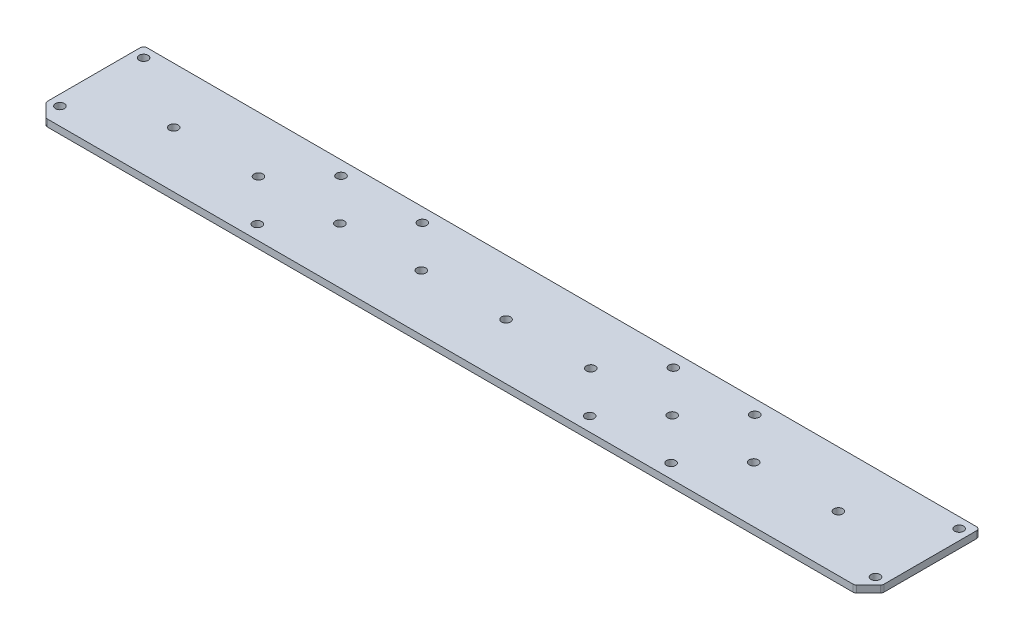
ISO-10303-21;
HEADER;
FILE_DESCRIPTION(('STEP AP214'),'2;1');
FILE_NAME('part.step','',(''),(''),'','','');
FILE_SCHEMA(('AUTOMOTIVE_DESIGN { 1 0 10303 214 1 1 1 1 }'));
ENDSEC;
DATA;
#1=APPLICATION_CONTEXT('core data for automotive mechanical design processes');
#2=APPLICATION_PROTOCOL_DEFINITION('international standard','automotive_design',2000,#1);
#3=PRODUCT_CONTEXT('',#1,'mechanical');
#4=PRODUCT('Part','Part','',(#3));
#5=PRODUCT_RELATED_PRODUCT_CATEGORY('part','',(#4));
#6=PRODUCT_DEFINITION_FORMATION('','',#4);
#7=PRODUCT_DEFINITION_CONTEXT('part definition',#1,'design');
#8=PRODUCT_DEFINITION('design','',#6,#7);
#9=PRODUCT_DEFINITION_SHAPE('','',#8);
#10=(LENGTH_UNIT() NAMED_UNIT(*) SI_UNIT(.MILLI.,.METRE.));
#11=(NAMED_UNIT(*) PLANE_ANGLE_UNIT() SI_UNIT($,.RADIAN.));
#12=(NAMED_UNIT(*) SI_UNIT($,.STERADIAN.) SOLID_ANGLE_UNIT());
#13=UNCERTAINTY_MEASURE_WITH_UNIT(LENGTH_MEASURE(1.E-05),#10,'distance_accuracy_value','');
#14=(GEOMETRIC_REPRESENTATION_CONTEXT(3) GLOBAL_UNCERTAINTY_ASSIGNED_CONTEXT((#13)) GLOBAL_UNIT_ASSIGNED_CONTEXT((#10,
#11,#12)) REPRESENTATION_CONTEXT('',''));
#15=CARTESIAN_POINT('',(0.,0.,0.));
#16=DIRECTION('',(0.,0.,1.));
#17=DIRECTION('',(1.,0.,0.));
#18=AXIS2_PLACEMENT_3D('',#15,#16,#17);
#19=CARTESIAN_POINT('',(0.,3.175,-50.7999999999972));
#20=DIRECTION('',(0.,0.,1.));
#21=DIRECTION('',(1.,0.,0.));
#22=AXIS2_PLACEMENT_3D('',#19,#20,#21);
#23=PLANE('',#22);
#24=DIRECTION('',(-1.,0.,0.));
#25=VECTOR('',#24,1.);
#26=CARTESIAN_POINT('',(0.,0.,-50.7999999999972));
#27=LINE('',#26,#25);
#28=CARTESIAN_POINT('',(379.412499999997,0.,-50.7999999999944));
#29=VERTEX_POINT('',#28);
#30=CARTESIAN_POINT('',(1.58749999999989,0.,-50.7999999999972));
#31=VERTEX_POINT('',#30);
#32=EDGE_CURVE('E226',#29,#31,#27,.T.);
#33=ORIENTED_EDGE('',*,*,#32,.T.);
#34=DIRECTION('',(0.,-1.,0.));
#35=VECTOR('',#34,1.);
#36=CARTESIAN_POINT('',(1.58749999999989,3.175,-50.7999999999972));
#37=LINE('',#36,#35);
#38=CARTESIAN_POINT('',(1.58749999999989,3.175,-50.7999999999972));
#39=VERTEX_POINT('',#38);
#40=EDGE_CURVE('E69',#31,#39,#37,.F.);
#41=ORIENTED_EDGE('',*,*,#40,.T.);
#42=DIRECTION('',(-1.,0.,0.));
#43=VECTOR('',#42,1.);
#44=CARTESIAN_POINT('',(0.,3.175,-50.7999999999972));
#45=LINE('',#44,#43);
#46=CARTESIAN_POINT('',(379.412499999997,3.175,-50.7999999999944));
#47=VERTEX_POINT('',#46);
#48=EDGE_CURVE('E165',#47,#39,#45,.T.);
#49=ORIENTED_EDGE('',*,*,#48,.F.);
#50=DIRECTION('',(0.,-1.,0.));
#51=VECTOR('',#50,1.);
#52=CARTESIAN_POINT('',(379.412499999997,3.175,-50.7999999999944));
#53=LINE('',#52,#51);
#54=EDGE_CURVE('E285',#47,#29,#53,.T.);
#55=ORIENTED_EDGE('',*,*,#54,.T.);
#56=EDGE_LOOP('',(#33,#41,#49,#55));
#57=FACE_BOUND('',#56,.T.);
#58=ADVANCED_FACE('F48',(#57),#23,.F.);
#59=CARTESIAN_POINT('',(-3.21964677141295E-12,3.175,-7.00756403026172));
#60=DIRECTION('',(1.,0.,0.));
#61=DIRECTION('',(0.,0.,-1.));
#62=AXIS2_PLACEMENT_3D('',#59,#60,#61);
#63=PLANE('',#62);
#64=DIRECTION('',(0.,0.,1.));
#65=VECTOR('',#64,1.);
#66=CARTESIAN_POINT('',(-3.21964677141295E-12,3.175,-7.00756403026172));
#67=LINE('',#66,#65);
#68=CARTESIAN_POINT('',(-1.16713974375621E-13,3.175,-49.2124999999973));
#69=VERTEX_POINT('',#68);
#70=CARTESIAN_POINT('',(-3.21964677141295E-12,3.175,-7.00756403026172));
#71=VERTEX_POINT('',#70);
#72=EDGE_CURVE('E154',#69,#71,#67,.T.);
#73=ORIENTED_EDGE('',*,*,#72,.F.);
#74=DIRECTION('',(0.,-1.,0.));
#75=VECTOR('',#74,1.);
#76=CARTESIAN_POINT('',(-1.16713974375621E-13,3.175,-49.2124999999973));
#77=LINE('',#76,#75);
#78=CARTESIAN_POINT('',(-1.16713974375621E-13,0.,-49.2124999999973));
#79=VERTEX_POINT('',#78);
#80=EDGE_CURVE('E175',#69,#79,#77,.T.);
#81=ORIENTED_EDGE('',*,*,#80,.T.);
#82=DIRECTION('',(0.,0.,1.));
#83=VECTOR('',#82,1.);
#84=CARTESIAN_POINT('',(-3.21964677141295E-12,0.,-7.00756403026172));
#85=LINE('',#84,#83);
#86=CARTESIAN_POINT('',(-3.21964677141295E-12,0.,-7.00756403026172));
#87=VERTEX_POINT('',#86);
#88=EDGE_CURVE('E171',#79,#87,#85,.T.);
#89=ORIENTED_EDGE('',*,*,#88,.T.);
#90=DIRECTION('',(0.,-1.,0.));
#91=VECTOR('',#90,1.);
#92=CARTESIAN_POINT('',(-3.21964677141295E-12,3.175,-7.00756403026172));
#93=LINE('',#92,#91);
#94=EDGE_CURVE('E168',#71,#87,#93,.T.);
#95=ORIENTED_EDGE('',*,*,#94,.F.);
#96=EDGE_LOOP('',(#73,#81,#89,#95));
#97=FACE_BOUND('',#96,.T.);
#98=ADVANCED_FACE('F169',(#97),#63,.F.);
#99=CARTESIAN_POINT('',(1.5874999999968,3.175,-7.00756403026172));
#100=DIRECTION('',(0.,-1.,0.));
#101=DIRECTION('',(0.,0.,-1.));
#102=AXIS2_PLACEMENT_3D('',#99,#100,#101);
#103=CYLINDRICAL_SURFACE('',#102,1.5875);
#104=CARTESIAN_POINT('',(1.5874999999968,0.,-7.00756403026172));
#105=DIRECTION('',(0.,1.,0.));
#106=DIRECTION('',(0.,0.,1.));
#107=AXIS2_PLACEMENT_3D('',#104,#105,#106);
#108=CIRCLE('',#107,1.5875);
#109=CARTESIAN_POINT('',(0.46496798486316,0.,-5.88503201512807));
#110=VERTEX_POINT('',#109);
#111=EDGE_CURVE('E232',#87,#110,#108,.T.);
#112=ORIENTED_EDGE('',*,*,#111,.T.);
#113=DIRECTION('',(0.,-1.,0.));
#114=VECTOR('',#113,1.);
#115=CARTESIAN_POINT('',(0.46496798486316,3.175,-5.88503201512807));
#116=LINE('',#115,#114);
#117=CARTESIAN_POINT('',(0.46496798486316,3.175,-5.88503201512807));
#118=VERTEX_POINT('',#117);
#119=EDGE_CURVE('E176',#118,#110,#116,.T.);
#120=ORIENTED_EDGE('',*,*,#119,.F.);
#121=CARTESIAN_POINT('',(1.5874999999968,3.175,-7.00756403026172));
#122=DIRECTION('',(0.,1.,0.));
#123=DIRECTION('',(0.,0.,1.));
#124=AXIS2_PLACEMENT_3D('',#121,#122,#123);
#125=CIRCLE('',#124,1.5875);
#126=EDGE_CURVE('E158',#71,#118,#125,.T.);
#127=ORIENTED_EDGE('',*,*,#126,.F.);
#128=ORIENTED_EDGE('',*,*,#94,.T.);
#129=EDGE_LOOP('',(#112,#120,#127,#128));
#130=FACE_BOUND('',#129,.T.);
#131=ADVANCED_FACE('F178',(#130),#103,.T.);
#132=CARTESIAN_POINT('',(5.88503201513041,3.175,-0.464967984860809));
#133=DIRECTION('',(0.70710678118655,0.,-0.707106781186545));
#134=DIRECTION('',(-0.707106781186545,0.,-0.70710678118655));
#135=AXIS2_PLACEMENT_3D('',#132,#133,#134);
#136=PLANE('',#135);
#137=DIRECTION('',(0.707106781186545,0.,0.70710678118655));
#138=VECTOR('',#137,1.);
#139=CARTESIAN_POINT('',(5.88503201513041,0.,-0.464967984860809));
#140=LINE('',#139,#138);
#141=CARTESIAN_POINT('',(5.88503201513041,0.,-0.464967984860809));
#142=VERTEX_POINT('',#141);
#143=EDGE_CURVE('E235',#110,#142,#140,.T.);
#144=ORIENTED_EDGE('',*,*,#143,.T.);
#145=DIRECTION('',(0.,-1.,0.));
#146=VECTOR('',#145,1.);
#147=CARTESIAN_POINT('',(5.88503201513041,3.175,-0.464967984860809));
#148=LINE('',#147,#146);
#149=CARTESIAN_POINT('',(5.88503201513041,3.175,-0.464967984860809));
#150=VERTEX_POINT('',#149);
#151=EDGE_CURVE('E275',#150,#142,#148,.T.);
#152=ORIENTED_EDGE('',*,*,#151,.F.);
#153=DIRECTION('',(0.707106781186545,0.,0.70710678118655));
#154=VECTOR('',#153,1.);
#155=CARTESIAN_POINT('',(5.88503201513041,3.175,-0.464967984860809));
#156=LINE('',#155,#154);
#157=EDGE_CURVE('E182',#118,#150,#156,.T.);
#158=ORIENTED_EDGE('',*,*,#157,.F.);
#159=ORIENTED_EDGE('',*,*,#119,.T.);
#160=EDGE_LOOP('',(#144,#152,#158,#159));
#161=FACE_BOUND('',#160,.T.);
#162=ADVANCED_FACE('F465',(#161),#136,.F.);
#163=CARTESIAN_POINT('',(7.00756403026404,3.175,-1.58749999999442));
#164=DIRECTION('',(0.,-1.,0.));
#165=DIRECTION('',(0.,0.,-1.));
#166=AXIS2_PLACEMENT_3D('',#163,#164,#165);
#167=CYLINDRICAL_SURFACE('',#166,1.58749999999998);
#168=CARTESIAN_POINT('',(7.00756403026404,0.,-1.58749999999442));
#169=DIRECTION('',(0.,1.,0.));
#170=DIRECTION('',(0.,0.,1.));
#171=AXIS2_PLACEMENT_3D('',#168,#169,#170);
#172=CIRCLE('',#171,1.58749999999998);
#173=CARTESIAN_POINT('',(7.00756403026404,0.,5.55957190007117E-12));
#174=VERTEX_POINT('',#173);
#175=EDGE_CURVE('E238',#142,#174,#172,.T.);
#176=ORIENTED_EDGE('',*,*,#175,.T.);
#177=DIRECTION('',(0.,-1.,0.));
#178=VECTOR('',#177,1.);
#179=CARTESIAN_POINT('',(7.00756403026404,3.175,5.55957190007117E-12));
#180=LINE('',#179,#178);
#181=CARTESIAN_POINT('',(7.00756403026404,3.175,5.55957190007117E-12));
#182=VERTEX_POINT('',#181);
#183=EDGE_CURVE('E271',#182,#174,#180,.T.);
#184=ORIENTED_EDGE('',*,*,#183,.F.);
#185=CARTESIAN_POINT('',(7.00756403026404,3.175,-1.58749999999442));
#186=DIRECTION('',(0.,1.,0.));
#187=DIRECTION('',(0.,0.,1.));
#188=AXIS2_PLACEMENT_3D('',#185,#186,#187);
#189=CIRCLE('',#188,1.58749999999998);
#190=EDGE_CURVE('E187',#150,#182,#189,.T.);
#191=ORIENTED_EDGE('',*,*,#190,.F.);
#192=ORIENTED_EDGE('',*,*,#151,.T.);
#193=EDGE_LOOP('',(#176,#184,#191,#192));
#194=FACE_BOUND('',#193,.T.);
#195=ADVANCED_FACE('F472',(#194),#167,.T.);
#196=CARTESIAN_POINT('',(373.992435969729,3.175,5.57593004926383E-12));
#197=DIRECTION('',(0.,0.,-1.));
#198=DIRECTION('',(-1.,0.,0.));
#199=AXIS2_PLACEMENT_3D('',#196,#197,#198);
#200=PLANE('',#199);
#201=DIRECTION('',(1.,0.,0.));
#202=VECTOR('',#201,1.);
#203=CARTESIAN_POINT('',(373.992435969729,0.,5.57593004926383E-12));
#204=LINE('',#203,#202);
#205=CARTESIAN_POINT('',(373.992435969729,0.,5.57593004926383E-12));
#206=VERTEX_POINT('',#205);
#207=EDGE_CURVE('E241',#174,#206,#204,.T.);
#208=ORIENTED_EDGE('',*,*,#207,.T.);
#209=DIRECTION('',(0.,-1.,0.));
#210=VECTOR('',#209,1.);
#211=CARTESIAN_POINT('',(373.992435969729,3.175,5.57593004926383E-12));
#212=LINE('',#211,#210);
#213=CARTESIAN_POINT('',(373.992435969729,3.175,5.57593004926383E-12));
#214=VERTEX_POINT('',#213);
#215=EDGE_CURVE('E267',#214,#206,#212,.T.);
#216=ORIENTED_EDGE('',*,*,#215,.F.);
#217=DIRECTION('',(1.,0.,0.));
#218=VECTOR('',#217,1.);
#219=CARTESIAN_POINT('',(373.992435969729,3.175,5.57593004926383E-12));
#220=LINE('',#219,#218);
#221=EDGE_CURVE('E204',#182,#214,#220,.T.);
#222=ORIENTED_EDGE('',*,*,#221,.F.);
#223=ORIENTED_EDGE('',*,*,#183,.T.);
#224=EDGE_LOOP('',(#208,#216,#222,#223));
#225=FACE_BOUND('',#224,.T.);
#226=ADVANCED_FACE('F475',(#225),#200,.F.);
#227=CARTESIAN_POINT('',(373.992435969729,3.175,-1.58749999999442));
#228=DIRECTION('',(0.,-1.,0.));
#229=DIRECTION('',(0.,0.,-1.));
#230=AXIS2_PLACEMENT_3D('',#227,#228,#229);
#231=CYLINDRICAL_SURFACE('',#230,1.58750000000001);
#232=CARTESIAN_POINT('',(373.992435969729,0.,-1.58749999999442));
#233=DIRECTION('',(0.,1.,0.));
#234=DIRECTION('',(0.,0.,1.));
#235=AXIS2_PLACEMENT_3D('',#232,#233,#234);
#236=CIRCLE('',#235,1.58750000000001);
#237=CARTESIAN_POINT('',(375.114967984863,0.,-0.464967984860794));
#238=VERTEX_POINT('',#237);
#239=EDGE_CURVE('E244',#206,#238,#236,.T.);
#240=ORIENTED_EDGE('',*,*,#239,.T.);
#241=DIRECTION('',(0.,-1.,0.));
#242=VECTOR('',#241,1.);
#243=CARTESIAN_POINT('',(375.114967984863,3.175,-0.464967984860794));
#244=LINE('',#243,#242);
#245=CARTESIAN_POINT('',(375.114967984863,3.175,-0.464967984860794));
#246=VERTEX_POINT('',#245);
#247=EDGE_CURVE('E263',#246,#238,#244,.T.);
#248=ORIENTED_EDGE('',*,*,#247,.F.);
#249=CARTESIAN_POINT('',(373.992435969729,3.175,-1.58749999999442));
#250=DIRECTION('',(0.,1.,0.));
#251=DIRECTION('',(0.,0.,1.));
#252=AXIS2_PLACEMENT_3D('',#249,#250,#251);
#253=CIRCLE('',#252,1.58750000000001);
#254=EDGE_CURVE('E208',#214,#246,#253,.T.);
#255=ORIENTED_EDGE('',*,*,#254,.F.);
#256=ORIENTED_EDGE('',*,*,#215,.T.);
#257=EDGE_LOOP('',(#240,#248,#255,#256));
#258=FACE_BOUND('',#257,.T.);
#259=ADVANCED_FACE('F480',(#258),#231,.T.);
#260=CARTESIAN_POINT('',(375.114967984863,3.175,-0.46496798486078));
#261=DIRECTION('',(-0.707106781186547,0.,-0.707106781186548));
#262=DIRECTION('',(-0.707106781186548,0.,0.707106781186547));
#263=AXIS2_PLACEMENT_3D('',#260,#261,#262);
#264=PLANE('',#263);
#265=DIRECTION('',(0.707106781186548,0.,-0.707106781186547));
#266=VECTOR('',#265,1.);
#267=CARTESIAN_POINT('',(375.114967984863,0.,-0.46496798486078));
#268=LINE('',#267,#266);
#269=CARTESIAN_POINT('',(380.53503201513,0.,-5.88503201512807));
#270=VERTEX_POINT('',#269);
#271=EDGE_CURVE('E247',#238,#270,#268,.T.);
#272=ORIENTED_EDGE('',*,*,#271,.T.);
#273=DIRECTION('',(0.,-1.,0.));
#274=VECTOR('',#273,1.);
#275=CARTESIAN_POINT('',(380.53503201513,3.175,-5.88503201512807));
#276=LINE('',#275,#274);
#277=CARTESIAN_POINT('',(380.53503201513,3.175,-5.88503201512807));
#278=VERTEX_POINT('',#277);
#279=EDGE_CURVE('E259',#278,#270,#276,.T.);
#280=ORIENTED_EDGE('',*,*,#279,.F.);
#281=DIRECTION('',(0.707106781186548,0.,-0.707106781186547));
#282=VECTOR('',#281,1.);
#283=CARTESIAN_POINT('',(375.114967984863,3.175,-0.46496798486078));
#284=LINE('',#283,#282);
#285=EDGE_CURVE('E212',#246,#278,#284,.T.);
#286=ORIENTED_EDGE('',*,*,#285,.F.);
#287=ORIENTED_EDGE('',*,*,#247,.T.);
#288=EDGE_LOOP('',(#272,#280,#286,#287));
#289=FACE_BOUND('',#288,.T.);
#290=ADVANCED_FACE('F487',(#289),#264,.F.);
#291=CARTESIAN_POINT('',(379.412499999997,3.175,-7.00756403026171));
#292=DIRECTION('',(0.,-1.,0.));
#293=DIRECTION('',(0.,0.,-1.));
#294=AXIS2_PLACEMENT_3D('',#291,#292,#293);
#295=CYLINDRICAL_SURFACE('',#294,1.58750000000002);
#296=CARTESIAN_POINT('',(379.412499999997,0.,-7.00756403026171));
#297=DIRECTION('',(0.,1.,0.));
#298=DIRECTION('',(0.,0.,1.));
#299=AXIS2_PLACEMENT_3D('',#296,#297,#298);
#300=CIRCLE('',#299,1.58750000000002);
#301=CARTESIAN_POINT('',(380.999999999997,0.,-7.00756403026171));
#302=VERTEX_POINT('',#301);
#303=EDGE_CURVE('E250',#270,#302,#300,.T.);
#304=ORIENTED_EDGE('',*,*,#303,.T.);
#305=DIRECTION('',(0.,-1.,0.));
#306=VECTOR('',#305,1.);
#307=CARTESIAN_POINT('',(380.999999999997,3.175,-7.00756403026171));
#308=LINE('',#307,#306);
#309=CARTESIAN_POINT('',(380.999999999997,3.175,-7.00756403026171));
#310=VERTEX_POINT('',#309);
#311=EDGE_CURVE('E225',#310,#302,#308,.T.);
#312=ORIENTED_EDGE('',*,*,#311,.F.);
#313=CARTESIAN_POINT('',(379.412499999997,3.175,-7.00756403026171));
#314=DIRECTION('',(0.,1.,0.));
#315=DIRECTION('',(0.,0.,1.));
#316=AXIS2_PLACEMENT_3D('',#313,#314,#315);
#317=CIRCLE('',#316,1.58750000000002);
#318=EDGE_CURVE('E218',#278,#310,#317,.T.);
#319=ORIENTED_EDGE('',*,*,#318,.F.);
#320=ORIENTED_EDGE('',*,*,#279,.T.);
#321=EDGE_LOOP('',(#304,#312,#319,#320));
#322=FACE_BOUND('',#321,.T.);
#323=ADVANCED_FACE('F491',(#322),#295,.T.);
#324=CARTESIAN_POINT('',(380.999999999997,3.175,-50.7999999999944));
#325=DIRECTION('',(-1.,0.,0.));
#326=DIRECTION('',(0.,0.,1.));
#327=AXIS2_PLACEMENT_3D('',#324,#325,#326);
#328=PLANE('',#327);
#329=DIRECTION('',(0.,0.,-1.));
#330=VECTOR('',#329,1.);
#331=CARTESIAN_POINT('',(380.999999999997,0.,-50.7999999999944));
#332=LINE('',#331,#330);
#333=CARTESIAN_POINT('',(380.999999999997,0.,-49.2124999999944));
#334=VERTEX_POINT('',#333);
#335=EDGE_CURVE('E253',#302,#334,#332,.T.);
#336=ORIENTED_EDGE('',*,*,#335,.T.);
#337=DIRECTION('',(0.,-1.,0.));
#338=VECTOR('',#337,1.);
#339=CARTESIAN_POINT('',(380.999999999997,3.175,-49.2124999999944));
#340=LINE('',#339,#338);
#341=CARTESIAN_POINT('',(380.999999999997,3.175,-49.2124999999944));
#342=VERTEX_POINT('',#341);
#343=EDGE_CURVE('E12',#334,#342,#340,.F.);
#344=ORIENTED_EDGE('',*,*,#343,.T.);
#345=DIRECTION('',(0.,0.,-1.));
#346=VECTOR('',#345,1.);
#347=CARTESIAN_POINT('',(380.999999999997,3.175,-50.7999999999944));
#348=LINE('',#347,#346);
#349=EDGE_CURVE('E221',#310,#342,#348,.T.);
#350=ORIENTED_EDGE('',*,*,#349,.F.);
#351=ORIENTED_EDGE('',*,*,#311,.T.);
#352=EDGE_LOOP('',(#336,#344,#350,#351));
#353=FACE_BOUND('',#352,.T.);
#354=ADVANCED_FACE('F493',(#353),#328,.F.);
#355=CARTESIAN_POINT('',(379.412499999997,3.175,-7.00756403026171));
#356=DIRECTION('',(0.,1.,0.));
#357=DIRECTION('',(0.,0.,1.));
#358=AXIS2_PLACEMENT_3D('',#355,#356,#357);
#359=PLANE('',#358);
#360=CARTESIAN_POINT('',(190.5,3.175,-25.399999999993));
#361=DIRECTION('',(0.,1.,0.));
#362=DIRECTION('',(0.,0.,1.));
#363=AXIS2_PLACEMENT_3D('',#360,#361,#362);
#364=CIRCLE('',#363,2.03200000000166);
#365=CARTESIAN_POINT('',(190.5,3.175,-23.3679999999914));
#366=VERTEX_POINT('',#365);
#367=EDGE_CURVE('E355',#366,#366,#364,.T.);
#368=ORIENTED_EDGE('',*,*,#367,.F.);
#369=EDGE_LOOP('',(#368));
#370=FACE_BOUND('',#369,.T.);
#371=CARTESIAN_POINT('',(133.35,3.175,-44.449999999993));
#372=DIRECTION('',(0.,1.,0.));
#373=DIRECTION('',(0.,0.,1.));
#374=AXIS2_PLACEMENT_3D('',#371,#372,#373);
#375=CIRCLE('',#374,2.0320000000016);
#376=CARTESIAN_POINT('',(133.35,3.175,-42.4179999999914));
#377=VERTEX_POINT('',#376);
#378=EDGE_CURVE('E367',#377,#377,#375,.T.);
#379=ORIENTED_EDGE('',*,*,#378,.F.);
#380=EDGE_LOOP('',(#379));
#381=FACE_BOUND('',#380,.T.);
#382=CARTESIAN_POINT('',(96.2659999999995,3.175,-44.449999999993));
#383=DIRECTION('',(0.,1.,0.));
#384=DIRECTION('',(0.,0.,1.));
#385=AXIS2_PLACEMENT_3D('',#382,#383,#384);
#386=CIRCLE('',#385,2.03200000000163);
#387=CARTESIAN_POINT('',(96.2659999999995,3.175,-42.4179999999914));
#388=VERTEX_POINT('',#387);
#389=EDGE_CURVE('E375',#388,#388,#386,.T.);
#390=ORIENTED_EDGE('',*,*,#389,.F.);
#391=EDGE_LOOP('',(#390));
#392=FACE_BOUND('',#391,.T.);
#393=CARTESIAN_POINT('',(96.2659999999995,3.175,-6.34999999999301));
#394=DIRECTION('',(0.,1.,0.));
#395=DIRECTION('',(0.,0.,1.));
#396=AXIS2_PLACEMENT_3D('',#393,#394,#395);
#397=CIRCLE('',#396,2.03200000000163);
#398=CARTESIAN_POINT('',(96.2659999999995,3.175,-4.31799999999138));
#399=VERTEX_POINT('',#398);
#400=EDGE_CURVE('E384',#399,#399,#397,.T.);
#401=ORIENTED_EDGE('',*,*,#400,.F.);
#402=EDGE_LOOP('',(#401));
#403=FACE_BOUND('',#402,.T.);
#404=CARTESIAN_POINT('',(77.7239999999995,3.175,-25.399999999993));
#405=DIRECTION('',(0.,1.,0.));
#406=DIRECTION('',(0.,0.,1.));
#407=AXIS2_PLACEMENT_3D('',#404,#405,#406);
#408=CIRCLE('',#407,2.03200000000163);
#409=CARTESIAN_POINT('',(77.7239999999995,3.175,-23.3679999999914));
#410=VERTEX_POINT('',#409);
#411=EDGE_CURVE('E393',#410,#410,#408,.T.);
#412=ORIENTED_EDGE('',*,*,#411,.F.);
#413=EDGE_LOOP('',(#412));
#414=FACE_BOUND('',#413,.T.);
#415=CARTESIAN_POINT('',(39.1159999999995,3.175,-25.399999999993));
#416=DIRECTION('',(0.,1.,0.));
#417=DIRECTION('',(0.,0.,1.));
#418=AXIS2_PLACEMENT_3D('',#415,#416,#417);
#419=CIRCLE('',#418,2.03200000000163);
#420=CARTESIAN_POINT('',(39.1159999999995,3.175,-23.3679999999914));
#421=VERTEX_POINT('',#420);
#422=EDGE_CURVE('E403',#421,#421,#419,.T.);
#423=ORIENTED_EDGE('',*,*,#422,.F.);
#424=EDGE_LOOP('',(#423));
#425=FACE_BOUND('',#424,.T.);
#426=CARTESIAN_POINT('',(151.891999999997,3.175,-25.3999999999944));
#427=DIRECTION('',(0.,1.,0.));
#428=DIRECTION('',(0.,0.,1.));
#429=AXIS2_PLACEMENT_3D('',#426,#427,#428);
#430=CIRCLE('',#429,2.03200000000395);
#431=CARTESIAN_POINT('',(151.891999999997,3.175,-23.3679999999905));
#432=VERTEX_POINT('',#431);
#433=EDGE_CURVE('E411',#432,#432,#430,.T.);
#434=ORIENTED_EDGE('',*,*,#433,.F.);
#435=EDGE_LOOP('',(#434));
#436=FACE_BOUND('',#435,.T.);
#437=CARTESIAN_POINT('',(229.107999999997,3.175,-25.3999999999944));
#438=DIRECTION('',(0.,1.,0.));
#439=DIRECTION('',(0.,0.,1.));
#440=AXIS2_PLACEMENT_3D('',#437,#438,#439);
#441=CIRCLE('',#440,2.03200000000395);
#442=CARTESIAN_POINT('',(229.107999999997,3.175,-23.3679999999905));
#443=VERTEX_POINT('',#442);
#444=EDGE_CURVE('E342',#443,#443,#441,.T.);
#445=ORIENTED_EDGE('',*,*,#444,.F.);
#446=EDGE_LOOP('',(#445));
#447=FACE_BOUND('',#446,.T.);
#448=CARTESIAN_POINT('',(341.884,3.175,-25.399999999993));
#449=DIRECTION('',(0.,1.,0.));
#450=DIRECTION('',(0.,0.,1.));
#451=AXIS2_PLACEMENT_3D('',#448,#449,#450);
#452=CIRCLE('',#451,2.0320000000016);
#453=CARTESIAN_POINT('',(341.884,3.175,-23.3679999999914));
#454=VERTEX_POINT('',#453);
#455=EDGE_CURVE('E330',#454,#454,#452,.T.);
#456=ORIENTED_EDGE('',*,*,#455,.F.);
#457=EDGE_LOOP('',(#456));
#458=FACE_BOUND('',#457,.T.);
#459=CARTESIAN_POINT('',(376.2375,3.175,-46.037499999993));
#460=DIRECTION('',(0.,1.,0.));
#461=DIRECTION('',(0.,0.,1.));
#462=AXIS2_PLACEMENT_3D('',#459,#460,#461);
#463=CIRCLE('',#462,2.0320000000016);
#464=CARTESIAN_POINT('',(376.2375,3.175,-44.0054999999914));
#465=VERTEX_POINT('',#464);
#466=EDGE_CURVE('E837',#465,#465,#463,.T.);
#467=ORIENTED_EDGE('',*,*,#466,.F.);
#468=EDGE_LOOP('',(#467));
#469=FACE_BOUND('',#468,.T.);
#470=CARTESIAN_POINT('',(376.2375,3.175,-7.93749999999301));
#471=DIRECTION('',(0.,1.,0.));
#472=DIRECTION('',(0.,0.,1.));
#473=AXIS2_PLACEMENT_3D('',#470,#471,#472);
#474=CIRCLE('',#473,2.0320000000016);
#475=CARTESIAN_POINT('',(376.2375,3.175,-5.9054999999914));
#476=VERTEX_POINT('',#475);
#477=EDGE_CURVE('E307',#476,#476,#474,.T.);
#478=ORIENTED_EDGE('',*,*,#477,.F.);
#479=EDGE_LOOP('',(#478));
#480=FACE_BOUND('',#479,.T.);
#481=CARTESIAN_POINT('',(4.76249999999961,3.175,-46.037499999993));
#482=DIRECTION('',(0.,1.,0.));
#483=DIRECTION('',(0.,0.,1.));
#484=AXIS2_PLACEMENT_3D('',#481,#482,#483);
#485=CIRCLE('',#484,2.03200000000163);
#486=CARTESIAN_POINT('',(4.76249999999961,3.175,-44.0054999999914));
#487=VERTEX_POINT('',#486);
#488=EDGE_CURVE('E323',#487,#487,#485,.T.);
#489=ORIENTED_EDGE('',*,*,#488,.F.);
#490=EDGE_LOOP('',(#489));
#491=FACE_BOUND('',#490,.T.);
#492=CARTESIAN_POINT('',(247.65,3.175,-44.449999999993));
#493=DIRECTION('',(0.,1.,0.));
#494=DIRECTION('',(0.,0.,1.));
#495=AXIS2_PLACEMENT_3D('',#492,#493,#494);
#496=CIRCLE('',#495,2.03200000000166);
#497=CARTESIAN_POINT('',(247.65,3.175,-42.4179999999914));
#498=VERTEX_POINT('',#497);
#499=EDGE_CURVE('E839',#498,#498,#496,.T.);
#500=ORIENTED_EDGE('',*,*,#499,.F.);
#501=EDGE_LOOP('',(#500));
#502=FACE_BOUND('',#501,.T.);
#503=CARTESIAN_POINT('',(284.733999999999,3.175,-44.449999999993));
#504=DIRECTION('',(0.,1.,0.));
#505=DIRECTION('',(0.,0.,1.));
#506=AXIS2_PLACEMENT_3D('',#503,#504,#505);
#507=CIRCLE('',#506,2.0320000000016);
#508=CARTESIAN_POINT('',(284.733999999999,3.175,-42.4179999999914));
#509=VERTEX_POINT('',#508);
#510=EDGE_CURVE('E848',#509,#509,#507,.T.);
#511=ORIENTED_EDGE('',*,*,#510,.F.);
#512=EDGE_LOOP('',(#511));
#513=FACE_BOUND('',#512,.T.);
#514=CARTESIAN_POINT('',(247.65,3.175,-6.34999999999301));
#515=DIRECTION('',(0.,1.,0.));
#516=DIRECTION('',(0.,0.,1.));
#517=AXIS2_PLACEMENT_3D('',#514,#515,#516);
#518=CIRCLE('',#517,2.03200000000166);
#519=CARTESIAN_POINT('',(247.65,3.175,-4.31799999999135));
#520=VERTEX_POINT('',#519);
#521=EDGE_CURVE('E857',#520,#520,#518,.T.);
#522=ORIENTED_EDGE('',*,*,#521,.F.);
#523=EDGE_LOOP('',(#522));
#524=FACE_BOUND('',#523,.T.);
#525=CARTESIAN_POINT('',(284.733999999999,3.175,-6.34999999999301));
#526=DIRECTION('',(0.,1.,0.));
#527=DIRECTION('',(0.,0.,1.));
#528=AXIS2_PLACEMENT_3D('',#525,#526,#527);
#529=CIRCLE('',#528,2.0320000000016);
#530=CARTESIAN_POINT('',(284.733999999999,3.175,-4.3179999999914));
#531=VERTEX_POINT('',#530);
#532=EDGE_CURVE('E354',#531,#531,#529,.T.);
#533=ORIENTED_EDGE('',*,*,#532,.F.);
#534=EDGE_LOOP('',(#533));
#535=FACE_BOUND('',#534,.T.);
#536=CARTESIAN_POINT('',(266.191999999997,3.175,-25.3999999999944));
#537=DIRECTION('',(0.,1.,0.));
#538=DIRECTION('',(0.,0.,1.));
#539=AXIS2_PLACEMENT_3D('',#536,#537,#538);
#540=CIRCLE('',#539,2.03200000000401);
#541=CARTESIAN_POINT('',(266.191999999997,3.175,-23.3679999999904));
#542=VERTEX_POINT('',#541);
#543=EDGE_CURVE('E822',#542,#542,#540,.T.);
#544=ORIENTED_EDGE('',*,*,#543,.F.);
#545=EDGE_LOOP('',(#544));
#546=FACE_BOUND('',#545,.T.);
#547=CARTESIAN_POINT('',(303.275999999997,3.175,-25.3999999999944));
#548=DIRECTION('',(0.,1.,0.));
#549=DIRECTION('',(0.,0.,1.));
#550=AXIS2_PLACEMENT_3D('',#547,#548,#549);
#551=CIRCLE('',#550,2.03200000000396);
#552=CARTESIAN_POINT('',(303.275999999997,3.175,-23.3679999999905));
#553=VERTEX_POINT('',#552);
#554=EDGE_CURVE('E805',#553,#553,#551,.T.);
#555=ORIENTED_EDGE('',*,*,#554,.F.);
#556=EDGE_LOOP('',(#555));
#557=FACE_BOUND('',#556,.T.);
#558=CARTESIAN_POINT('',(114.808,3.175,-25.399999999993));
#559=DIRECTION('',(0.,1.,0.));
#560=DIRECTION('',(0.,0.,1.));
#561=AXIS2_PLACEMENT_3D('',#558,#559,#560);
#562=CIRCLE('',#561,2.03200000000163);
#563=CARTESIAN_POINT('',(114.808,3.175,-23.3679999999914));
#564=VERTEX_POINT('',#563);
#565=EDGE_CURVE('E801',#564,#564,#562,.T.);
#566=ORIENTED_EDGE('',*,*,#565,.F.);
#567=EDGE_LOOP('',(#566));
#568=FACE_BOUND('',#567,.T.);
#569=CARTESIAN_POINT('',(4.76249999999961,3.175,-7.93749999999303));
#570=DIRECTION('',(0.,1.,0.));
#571=DIRECTION('',(0.,0.,1.));
#572=AXIS2_PLACEMENT_3D('',#569,#570,#571);
#573=CIRCLE('',#572,2.03200000000163);
#574=CARTESIAN_POINT('',(4.76249999999961,3.175,-5.9054999999914));
#575=VERTEX_POINT('',#574);
#576=EDGE_CURVE('E229',#575,#575,#573,.T.);
#577=ORIENTED_EDGE('',*,*,#576,.F.);
#578=EDGE_LOOP('',(#577));
#579=FACE_BOUND('',#578,.T.);
#580=ORIENTED_EDGE('',*,*,#48,.T.);
#581=CARTESIAN_POINT('',(1.58749999999988,3.175,-49.2124999999972));
#582=DIRECTION('',(0.,1.,0.));
#583=DIRECTION('',(0.,0.,1.));
#584=AXIS2_PLACEMENT_3D('',#581,#582,#583);
#585=CIRCLE('',#584,1.5875);
#586=EDGE_CURVE('E56',#39,#69,#585,.T.);
#587=ORIENTED_EDGE('',*,*,#586,.T.);
#588=ORIENTED_EDGE('',*,*,#72,.T.);
#589=ORIENTED_EDGE('',*,*,#126,.T.);
#590=ORIENTED_EDGE('',*,*,#157,.T.);
#591=ORIENTED_EDGE('',*,*,#190,.T.);
#592=ORIENTED_EDGE('',*,*,#221,.T.);
#593=ORIENTED_EDGE('',*,*,#254,.T.);
#594=ORIENTED_EDGE('',*,*,#285,.T.);
#595=ORIENTED_EDGE('',*,*,#318,.T.);
#596=ORIENTED_EDGE('',*,*,#349,.T.);
#597=CARTESIAN_POINT('',(379.412499999997,3.175,-49.2124999999944));
#598=DIRECTION('',(0.,1.,0.));
#599=DIRECTION('',(0.,0.,1.));
#600=AXIS2_PLACEMENT_3D('',#597,#598,#599);
#601=CIRCLE('',#600,1.5875);
#602=EDGE_CURVE('E288',#342,#47,#601,.T.);
#603=ORIENTED_EDGE('',*,*,#602,.T.);
#604=EDGE_LOOP('',(#580,#587,#588,#589,#590,#591,#592,#593,#594,#595,#596,#603));
#605=FACE_BOUND('',#604,.T.);
#606=ADVANCED_FACE('F156',(#370,#381,#392,#403,#414,#425,#436,#447,#458,#469,#480,#491,#502,
#513,#524,#535,#546,#557,#568,#579,#605),#359,.T.);
#607=CARTESIAN_POINT('',(379.412499999997,0.,-7.00756403026171));
#608=DIRECTION('',(0.,1.,0.));
#609=DIRECTION('',(0.,0.,1.));
#610=AXIS2_PLACEMENT_3D('',#607,#608,#609);
#611=PLANE('',#610);
#612=CARTESIAN_POINT('',(190.5,0.,-25.399999999993));
#613=DIRECTION('',(0.,1.,0.));
#614=DIRECTION('',(0.,0.,1.));
#615=AXIS2_PLACEMENT_3D('',#612,#613,#614);
#616=CIRCLE('',#615,2.03200000000166);
#617=CARTESIAN_POINT('',(190.5,0.,-23.3679999999914));
#618=VERTEX_POINT('',#617);
#619=EDGE_CURVE('E350',#618,#618,#616,.T.);
#620=ORIENTED_EDGE('',*,*,#619,.T.);
#621=EDGE_LOOP('',(#620));
#622=FACE_BOUND('',#621,.T.);
#623=CARTESIAN_POINT('',(133.35,0.,-44.449999999993));
#624=DIRECTION('',(0.,1.,0.));
#625=DIRECTION('',(0.,0.,1.));
#626=AXIS2_PLACEMENT_3D('',#623,#624,#625);
#627=CIRCLE('',#626,2.0320000000016);
#628=CARTESIAN_POINT('',(133.35,0.,-42.4179999999914));
#629=VERTEX_POINT('',#628);
#630=EDGE_CURVE('E360',#629,#629,#627,.T.);
#631=ORIENTED_EDGE('',*,*,#630,.T.);
#632=EDGE_LOOP('',(#631));
#633=FACE_BOUND('',#632,.T.);
#634=CARTESIAN_POINT('',(96.2659999999995,0.,-44.449999999993));
#635=DIRECTION('',(0.,1.,0.));
#636=DIRECTION('',(0.,0.,1.));
#637=AXIS2_PLACEMENT_3D('',#634,#635,#636);
#638=CIRCLE('',#637,2.03200000000163);
#639=CARTESIAN_POINT('',(96.2659999999995,0.,-42.4179999999914));
#640=VERTEX_POINT('',#639);
#641=EDGE_CURVE('E372',#640,#640,#638,.T.);
#642=ORIENTED_EDGE('',*,*,#641,.T.);
#643=EDGE_LOOP('',(#642));
#644=FACE_BOUND('',#643,.T.);
#645=CARTESIAN_POINT('',(96.2659999999995,0.,-6.34999999999301));
#646=DIRECTION('',(0.,1.,0.));
#647=DIRECTION('',(0.,0.,1.));
#648=AXIS2_PLACEMENT_3D('',#645,#646,#647);
#649=CIRCLE('',#648,2.03200000000163);
#650=CARTESIAN_POINT('',(96.2659999999995,0.,-4.31799999999138));
#651=VERTEX_POINT('',#650);
#652=EDGE_CURVE('E380',#651,#651,#649,.T.);
#653=ORIENTED_EDGE('',*,*,#652,.T.);
#654=EDGE_LOOP('',(#653));
#655=FACE_BOUND('',#654,.T.);
#656=CARTESIAN_POINT('',(77.7239999999995,0.,-25.399999999993));
#657=DIRECTION('',(0.,1.,0.));
#658=DIRECTION('',(0.,0.,1.));
#659=AXIS2_PLACEMENT_3D('',#656,#657,#658);
#660=CIRCLE('',#659,2.03200000000163);
#661=CARTESIAN_POINT('',(77.7239999999995,0.,-23.3679999999914));
#662=VERTEX_POINT('',#661);
#663=EDGE_CURVE('E389',#662,#662,#660,.T.);
#664=ORIENTED_EDGE('',*,*,#663,.T.);
#665=EDGE_LOOP('',(#664));
#666=FACE_BOUND('',#665,.T.);
#667=CARTESIAN_POINT('',(39.1159999999995,0.,-25.399999999993));
#668=DIRECTION('',(0.,1.,0.));
#669=DIRECTION('',(0.,0.,1.));
#670=AXIS2_PLACEMENT_3D('',#667,#668,#669);
#671=CIRCLE('',#670,2.03200000000163);
#672=CARTESIAN_POINT('',(39.1159999999995,0.,-23.3679999999914));
#673=VERTEX_POINT('',#672);
#674=EDGE_CURVE('E399',#673,#673,#671,.T.);
#675=ORIENTED_EDGE('',*,*,#674,.T.);
#676=EDGE_LOOP('',(#675));
#677=FACE_BOUND('',#676,.T.);
#678=CARTESIAN_POINT('',(151.891999999997,0.,-25.3999999999944));
#679=DIRECTION('',(0.,1.,0.));
#680=DIRECTION('',(0.,0.,1.));
#681=AXIS2_PLACEMENT_3D('',#678,#679,#680);
#682=CIRCLE('',#681,2.03200000000395);
#683=CARTESIAN_POINT('',(151.891999999997,0.,-23.3679999999905));
#684=VERTEX_POINT('',#683);
#685=EDGE_CURVE('E408',#684,#684,#682,.T.);
#686=ORIENTED_EDGE('',*,*,#685,.T.);
#687=EDGE_LOOP('',(#686));
#688=FACE_BOUND('',#687,.T.);
#689=CARTESIAN_POINT('',(229.107999999997,0.,-25.3999999999944));
#690=DIRECTION('',(0.,1.,0.));
#691=DIRECTION('',(0.,0.,1.));
#692=AXIS2_PLACEMENT_3D('',#689,#690,#691);
#693=CIRCLE('',#692,2.03200000000395);
#694=CARTESIAN_POINT('',(229.107999999997,0.,-23.3679999999905));
#695=VERTEX_POINT('',#694);
#696=EDGE_CURVE('E348',#695,#695,#693,.T.);
#697=ORIENTED_EDGE('',*,*,#696,.T.);
#698=EDGE_LOOP('',(#697));
#699=FACE_BOUND('',#698,.T.);
#700=CARTESIAN_POINT('',(341.884,0.,-25.399999999993));
#701=DIRECTION('',(0.,1.,0.));
#702=DIRECTION('',(0.,0.,1.));
#703=AXIS2_PLACEMENT_3D('',#700,#701,#702);
#704=CIRCLE('',#703,2.0320000000016);
#705=CARTESIAN_POINT('',(341.884,0.,-23.3679999999914));
#706=VERTEX_POINT('',#705);
#707=EDGE_CURVE('E335',#706,#706,#704,.T.);
#708=ORIENTED_EDGE('',*,*,#707,.T.);
#709=EDGE_LOOP('',(#708));
#710=FACE_BOUND('',#709,.T.);
#711=CARTESIAN_POINT('',(376.2375,0.,-46.037499999993));
#712=DIRECTION('',(0.,1.,0.));
#713=DIRECTION('',(0.,0.,1.));
#714=AXIS2_PLACEMENT_3D('',#711,#712,#713);
#715=CIRCLE('',#714,2.0320000000016);
#716=CARTESIAN_POINT('',(376.2375,0.,-44.0054999999914));
#717=VERTEX_POINT('',#716);
#718=EDGE_CURVE('E313',#717,#717,#715,.T.);
#719=ORIENTED_EDGE('',*,*,#718,.T.);
#720=EDGE_LOOP('',(#719));
#721=FACE_BOUND('',#720,.T.);
#722=CARTESIAN_POINT('',(376.2375,0.,-7.93749999999301));
#723=DIRECTION('',(0.,1.,0.));
#724=DIRECTION('',(0.,0.,1.));
#725=AXIS2_PLACEMENT_3D('',#722,#723,#724);
#726=CIRCLE('',#725,2.0320000000016);
#727=CARTESIAN_POINT('',(376.2375,0.,-5.9054999999914));
#728=VERTEX_POINT('',#727);
#729=EDGE_CURVE('E312',#728,#728,#726,.T.);
#730=ORIENTED_EDGE('',*,*,#729,.T.);
#731=EDGE_LOOP('',(#730));
#732=FACE_BOUND('',#731,.T.);
#733=CARTESIAN_POINT('',(4.76249999999961,0.,-46.037499999993));
#734=DIRECTION('',(0.,1.,0.));
#735=DIRECTION('',(0.,0.,1.));
#736=AXIS2_PLACEMENT_3D('',#733,#734,#735);
#737=CIRCLE('',#736,2.03200000000163);
#738=CARTESIAN_POINT('',(4.76249999999961,0.,-44.0054999999914));
#739=VERTEX_POINT('',#738);
#740=EDGE_CURVE('E302',#739,#739,#737,.T.);
#741=ORIENTED_EDGE('',*,*,#740,.T.);
#742=EDGE_LOOP('',(#741));
#743=FACE_BOUND('',#742,.T.);
#744=CARTESIAN_POINT('',(247.65,0.,-44.449999999993));
#745=DIRECTION('',(0.,1.,0.));
#746=DIRECTION('',(0.,0.,1.));
#747=AXIS2_PLACEMENT_3D('',#744,#745,#746);
#748=CIRCLE('',#747,2.03200000000166);
#749=CARTESIAN_POINT('',(247.65,0.,-42.4179999999914));
#750=VERTEX_POINT('',#749);
#751=EDGE_CURVE('E336',#750,#750,#748,.T.);
#752=ORIENTED_EDGE('',*,*,#751,.T.);
#753=EDGE_LOOP('',(#752));
#754=FACE_BOUND('',#753,.T.);
#755=CARTESIAN_POINT('',(284.733999999999,0.,-44.449999999993));
#756=DIRECTION('',(0.,1.,0.));
#757=DIRECTION('',(0.,0.,1.));
#758=AXIS2_PLACEMENT_3D('',#755,#756,#757);
#759=CIRCLE('',#758,2.0320000000016);
#760=CARTESIAN_POINT('',(284.733999999999,0.,-42.4179999999914));
#761=VERTEX_POINT('',#760);
#762=EDGE_CURVE('E842',#761,#761,#759,.T.);
#763=ORIENTED_EDGE('',*,*,#762,.T.);
#764=EDGE_LOOP('',(#763));
#765=FACE_BOUND('',#764,.T.);
#766=CARTESIAN_POINT('',(247.65,0.,-6.34999999999301));
#767=DIRECTION('',(0.,1.,0.));
#768=DIRECTION('',(0.,0.,1.));
#769=AXIS2_PLACEMENT_3D('',#766,#767,#768);
#770=CIRCLE('',#769,2.03200000000166);
#771=CARTESIAN_POINT('',(247.65,0.,-4.31799999999135));
#772=VERTEX_POINT('',#771);
#773=EDGE_CURVE('E852',#772,#772,#770,.T.);
#774=ORIENTED_EDGE('',*,*,#773,.T.);
#775=EDGE_LOOP('',(#774));
#776=FACE_BOUND('',#775,.T.);
#777=CARTESIAN_POINT('',(284.733999999999,0.,-6.34999999999301));
#778=DIRECTION('',(0.,1.,0.));
#779=DIRECTION('',(0.,0.,1.));
#780=AXIS2_PLACEMENT_3D('',#777,#778,#779);
#781=CIRCLE('',#780,2.0320000000016);
#782=CARTESIAN_POINT('',(284.733999999999,0.,-4.3179999999914));
#783=VERTEX_POINT('',#782);
#784=EDGE_CURVE('E854',#783,#783,#781,.T.);
#785=ORIENTED_EDGE('',*,*,#784,.T.);
#786=EDGE_LOOP('',(#785));
#787=FACE_BOUND('',#786,.T.);
#788=CARTESIAN_POINT('',(266.191999999997,0.,-25.3999999999944));
#789=DIRECTION('',(0.,1.,0.));
#790=DIRECTION('',(0.,0.,1.));
#791=AXIS2_PLACEMENT_3D('',#788,#789,#790);
#792=CIRCLE('',#791,2.03200000000401);
#793=CARTESIAN_POINT('',(266.191999999997,0.,-23.3679999999904));
#794=VERTEX_POINT('',#793);
#795=EDGE_CURVE('E349',#794,#794,#792,.T.);
#796=ORIENTED_EDGE('',*,*,#795,.T.);
#797=EDGE_LOOP('',(#796));
#798=FACE_BOUND('',#797,.T.);
#799=CARTESIAN_POINT('',(303.275999999997,0.,-25.3999999999944));
#800=DIRECTION('',(0.,1.,0.));
#801=DIRECTION('',(0.,0.,1.));
#802=AXIS2_PLACEMENT_3D('',#799,#800,#801);
#803=CIRCLE('',#802,2.03200000000396);
#804=CARTESIAN_POINT('',(303.275999999997,0.,-23.3679999999905));
#805=VERTEX_POINT('',#804);
#806=EDGE_CURVE('E811',#805,#805,#803,.T.);
#807=ORIENTED_EDGE('',*,*,#806,.T.);
#808=EDGE_LOOP('',(#807));
#809=FACE_BOUND('',#808,.T.);
#810=CARTESIAN_POINT('',(114.808,0.,-25.399999999993));
#811=DIRECTION('',(0.,1.,0.));
#812=DIRECTION('',(0.,0.,1.));
#813=AXIS2_PLACEMENT_3D('',#810,#811,#812);
#814=CIRCLE('',#813,2.03200000000163);
#815=CARTESIAN_POINT('',(114.808,0.,-23.3679999999914));
#816=VERTEX_POINT('',#815);
#817=EDGE_CURVE('E803',#816,#816,#814,.T.);
#818=ORIENTED_EDGE('',*,*,#817,.T.);
#819=EDGE_LOOP('',(#818));
#820=FACE_BOUND('',#819,.T.);
#821=CARTESIAN_POINT('',(4.76249999999961,0.,-7.93749999999303));
#822=DIRECTION('',(0.,1.,0.));
#823=DIRECTION('',(0.,0.,1.));
#824=AXIS2_PLACEMENT_3D('',#821,#822,#823);
#825=CIRCLE('',#824,2.03200000000163);
#826=CARTESIAN_POINT('',(4.76249999999961,0.,-5.9054999999914));
#827=VERTEX_POINT('',#826);
#828=EDGE_CURVE('E300',#827,#827,#825,.T.);
#829=ORIENTED_EDGE('',*,*,#828,.T.);
#830=EDGE_LOOP('',(#829));
#831=FACE_BOUND('',#830,.T.);
#832=ORIENTED_EDGE('',*,*,#88,.F.);
#833=CARTESIAN_POINT('',(1.58749999999988,0.,-49.2124999999972));
#834=DIRECTION('',(0.,1.,0.));
#835=DIRECTION('',(0.,0.,1.));
#836=AXIS2_PLACEMENT_3D('',#833,#834,#835);
#837=CIRCLE('',#836,1.5875);
#838=EDGE_CURVE('E283',#79,#31,#837,.F.);
#839=ORIENTED_EDGE('',*,*,#838,.T.);
#840=ORIENTED_EDGE('',*,*,#32,.F.);
#841=CARTESIAN_POINT('',(379.412499999997,0.,-49.2124999999944));
#842=DIRECTION('',(0.,1.,0.));
#843=DIRECTION('',(0.,0.,1.));
#844=AXIS2_PLACEMENT_3D('',#841,#842,#843);
#845=CIRCLE('',#844,1.5875);
#846=EDGE_CURVE('E281',#29,#334,#845,.F.);
#847=ORIENTED_EDGE('',*,*,#846,.T.);
#848=ORIENTED_EDGE('',*,*,#335,.F.);
#849=ORIENTED_EDGE('',*,*,#303,.F.);
#850=ORIENTED_EDGE('',*,*,#271,.F.);
#851=ORIENTED_EDGE('',*,*,#239,.F.);
#852=ORIENTED_EDGE('',*,*,#207,.F.);
#853=ORIENTED_EDGE('',*,*,#175,.F.);
#854=ORIENTED_EDGE('',*,*,#143,.F.);
#855=ORIENTED_EDGE('',*,*,#111,.F.);
#856=EDGE_LOOP('',(#832,#839,#840,#847,#848,#849,#850,#851,#852,#853,#854,#855));
#857=FACE_BOUND('',#856,.T.);
#858=ADVANCED_FACE('F423',(#622,#633,#644,#655,#666,#677,#688,#699,#710,#721,#732,#743,#754,
#765,#776,#787,#798,#809,#820,#831,#857),#611,.F.);
#859=CARTESIAN_POINT('',(4.76249999999961,3.175,-7.93749999999303));
#860=DIRECTION('',(0.,-1.,0.));
#861=DIRECTION('',(0.,0.,-1.));
#862=AXIS2_PLACEMENT_3D('',#859,#860,#861);
#863=CYLINDRICAL_SURFACE('',#862,2.03200000000163);
#864=ORIENTED_EDGE('',*,*,#576,.T.);
#865=EDGE_LOOP('',(#864));
#866=FACE_BOUND('',#865,.T.);
#867=ORIENTED_EDGE('',*,*,#828,.F.);
#868=EDGE_LOOP('',(#867));
#869=FACE_BOUND('',#868,.T.);
#870=ADVANCED_FACE('F556',(#866,#869),#863,.F.);
#871=CARTESIAN_POINT('',(114.808,3.175,-25.399999999993));
#872=DIRECTION('',(0.,-1.,0.));
#873=DIRECTION('',(0.,0.,-1.));
#874=AXIS2_PLACEMENT_3D('',#871,#872,#873);
#875=CYLINDRICAL_SURFACE('',#874,2.03200000000163);
#876=ORIENTED_EDGE('',*,*,#565,.T.);
#877=EDGE_LOOP('',(#876));
#878=FACE_BOUND('',#877,.T.);
#879=ORIENTED_EDGE('',*,*,#817,.F.);
#880=EDGE_LOOP('',(#879));
#881=FACE_BOUND('',#880,.T.);
#882=ADVANCED_FACE('F560',(#878,#881),#875,.F.);
#883=CARTESIAN_POINT('',(303.275999999997,3.175,-25.3999999999944));
#884=DIRECTION('',(0.,-1.,0.));
#885=DIRECTION('',(0.,0.,-1.));
#886=AXIS2_PLACEMENT_3D('',#883,#884,#885);
#887=CYLINDRICAL_SURFACE('',#886,2.03200000000396);
#888=ORIENTED_EDGE('',*,*,#554,.T.);
#889=EDGE_LOOP('',(#888));
#890=FACE_BOUND('',#889,.T.);
#891=ORIENTED_EDGE('',*,*,#806,.F.);
#892=EDGE_LOOP('',(#891));
#893=FACE_BOUND('',#892,.T.);
#894=ADVANCED_FACE('F570',(#890,#893),#887,.F.);
#895=CARTESIAN_POINT('',(266.191999999997,3.175,-25.3999999999944));
#896=DIRECTION('',(0.,-1.,0.));
#897=DIRECTION('',(0.,0.,-1.));
#898=AXIS2_PLACEMENT_3D('',#895,#896,#897);
#899=CYLINDRICAL_SURFACE('',#898,2.03200000000401);
#900=ORIENTED_EDGE('',*,*,#543,.T.);
#901=EDGE_LOOP('',(#900));
#902=FACE_BOUND('',#901,.T.);
#903=ORIENTED_EDGE('',*,*,#795,.F.);
#904=EDGE_LOOP('',(#903));
#905=FACE_BOUND('',#904,.T.);
#906=ADVANCED_FACE('F579',(#902,#905),#899,.F.);
#907=CARTESIAN_POINT('',(284.733999999999,3.175,-6.34999999999301));
#908=DIRECTION('',(0.,-1.,0.));
#909=DIRECTION('',(0.,0.,-1.));
#910=AXIS2_PLACEMENT_3D('',#907,#908,#909);
#911=CYLINDRICAL_SURFACE('',#910,2.0320000000016);
#912=ORIENTED_EDGE('',*,*,#532,.T.);
#913=EDGE_LOOP('',(#912));
#914=FACE_BOUND('',#913,.T.);
#915=ORIENTED_EDGE('',*,*,#784,.F.);
#916=EDGE_LOOP('',(#915));
#917=FACE_BOUND('',#916,.T.);
#918=ADVANCED_FACE('F588',(#914,#917),#911,.F.);
#919=CARTESIAN_POINT('',(247.65,3.175,-6.34999999999301));
#920=DIRECTION('',(0.,-1.,0.));
#921=DIRECTION('',(0.,0.,-1.));
#922=AXIS2_PLACEMENT_3D('',#919,#920,#921);
#923=CYLINDRICAL_SURFACE('',#922,2.03200000000166);
#924=ORIENTED_EDGE('',*,*,#521,.T.);
#925=EDGE_LOOP('',(#924));
#926=FACE_BOUND('',#925,.T.);
#927=ORIENTED_EDGE('',*,*,#773,.F.);
#928=EDGE_LOOP('',(#927));
#929=FACE_BOUND('',#928,.T.);
#930=ADVANCED_FACE('F597',(#926,#929),#923,.F.);
#931=CARTESIAN_POINT('',(284.733999999999,3.175,-44.449999999993));
#932=DIRECTION('',(0.,-1.,0.));
#933=DIRECTION('',(0.,0.,-1.));
#934=AXIS2_PLACEMENT_3D('',#931,#932,#933);
#935=CYLINDRICAL_SURFACE('',#934,2.0320000000016);
#936=ORIENTED_EDGE('',*,*,#510,.T.);
#937=EDGE_LOOP('',(#936));
#938=FACE_BOUND('',#937,.T.);
#939=ORIENTED_EDGE('',*,*,#762,.F.);
#940=EDGE_LOOP('',(#939));
#941=FACE_BOUND('',#940,.T.);
#942=ADVANCED_FACE('F606',(#938,#941),#935,.F.);
#943=CARTESIAN_POINT('',(247.65,3.175,-44.449999999993));
#944=DIRECTION('',(0.,-1.,0.));
#945=DIRECTION('',(0.,0.,-1.));
#946=AXIS2_PLACEMENT_3D('',#943,#944,#945);
#947=CYLINDRICAL_SURFACE('',#946,2.03200000000166);
#948=ORIENTED_EDGE('',*,*,#499,.T.);
#949=EDGE_LOOP('',(#948));
#950=FACE_BOUND('',#949,.T.);
#951=ORIENTED_EDGE('',*,*,#751,.F.);
#952=EDGE_LOOP('',(#951));
#953=FACE_BOUND('',#952,.T.);
#954=ADVANCED_FACE('F615',(#950,#953),#947,.F.);
#955=CARTESIAN_POINT('',(4.76249999999961,3.175,-46.037499999993));
#956=DIRECTION('',(0.,-1.,0.));
#957=DIRECTION('',(0.,0.,-1.));
#958=AXIS2_PLACEMENT_3D('',#955,#956,#957);
#959=CYLINDRICAL_SURFACE('',#958,2.03200000000163);
#960=ORIENTED_EDGE('',*,*,#488,.T.);
#961=EDGE_LOOP('',(#960));
#962=FACE_BOUND('',#961,.T.);
#963=ORIENTED_EDGE('',*,*,#740,.F.);
#964=EDGE_LOOP('',(#963));
#965=FACE_BOUND('',#964,.T.);
#966=ADVANCED_FACE('F624',(#962,#965),#959,.F.);
#967=CARTESIAN_POINT('',(376.2375,3.175,-7.93749999999301));
#968=DIRECTION('',(0.,-1.,0.));
#969=DIRECTION('',(0.,0.,-1.));
#970=AXIS2_PLACEMENT_3D('',#967,#968,#969);
#971=CYLINDRICAL_SURFACE('',#970,2.0320000000016);
#972=ORIENTED_EDGE('',*,*,#477,.T.);
#973=EDGE_LOOP('',(#972));
#974=FACE_BOUND('',#973,.T.);
#975=ORIENTED_EDGE('',*,*,#729,.F.);
#976=EDGE_LOOP('',(#975));
#977=FACE_BOUND('',#976,.T.);
#978=ADVANCED_FACE('F633',(#974,#977),#971,.F.);
#979=CARTESIAN_POINT('',(376.2375,3.175,-46.037499999993));
#980=DIRECTION('',(0.,-1.,0.));
#981=DIRECTION('',(0.,0.,-1.));
#982=AXIS2_PLACEMENT_3D('',#979,#980,#981);
#983=CYLINDRICAL_SURFACE('',#982,2.0320000000016);
#984=ORIENTED_EDGE('',*,*,#466,.T.);
#985=EDGE_LOOP('',(#984));
#986=FACE_BOUND('',#985,.T.);
#987=ORIENTED_EDGE('',*,*,#718,.F.);
#988=EDGE_LOOP('',(#987));
#989=FACE_BOUND('',#988,.T.);
#990=ADVANCED_FACE('F439',(#986,#989),#983,.F.);
#991=CARTESIAN_POINT('',(341.884,3.175,-25.399999999993));
#992=DIRECTION('',(0.,-1.,0.));
#993=DIRECTION('',(0.,0.,-1.));
#994=AXIS2_PLACEMENT_3D('',#991,#992,#993);
#995=CYLINDRICAL_SURFACE('',#994,2.0320000000016);
#996=ORIENTED_EDGE('',*,*,#455,.T.);
#997=EDGE_LOOP('',(#996));
#998=FACE_BOUND('',#997,.T.);
#999=ORIENTED_EDGE('',*,*,#707,.F.);
#1000=EDGE_LOOP('',(#999));
#1001=FACE_BOUND('',#1000,.T.);
#1002=ADVANCED_FACE('F429',(#998,#1001),#995,.F.);
#1003=CARTESIAN_POINT('',(229.107999999997,3.175,-25.3999999999944));
#1004=DIRECTION('',(0.,-1.,0.));
#1005=DIRECTION('',(0.,0.,-1.));
#1006=AXIS2_PLACEMENT_3D('',#1003,#1004,#1005);
#1007=CYLINDRICAL_SURFACE('',#1006,2.03200000000395);
#1008=ORIENTED_EDGE('',*,*,#444,.T.);
#1009=EDGE_LOOP('',(#1008));
#1010=FACE_BOUND('',#1009,.T.);
#1011=ORIENTED_EDGE('',*,*,#696,.F.);
#1012=EDGE_LOOP('',(#1011));
#1013=FACE_BOUND('',#1012,.T.);
#1014=ADVANCED_FACE('F426',(#1010,#1013),#1007,.F.);
#1015=CARTESIAN_POINT('',(151.891999999997,3.175,-25.3999999999944));
#1016=DIRECTION('',(0.,-1.,0.));
#1017=DIRECTION('',(0.,0.,-1.));
#1018=AXIS2_PLACEMENT_3D('',#1015,#1016,#1017);
#1019=CYLINDRICAL_SURFACE('',#1018,2.03200000000395);
#1020=ORIENTED_EDGE('',*,*,#433,.T.);
#1021=EDGE_LOOP('',(#1020));
#1022=FACE_BOUND('',#1021,.T.);
#1023=ORIENTED_EDGE('',*,*,#685,.F.);
#1024=EDGE_LOOP('',(#1023));
#1025=FACE_BOUND('',#1024,.T.);
#1026=ADVANCED_FACE('F428',(#1022,#1025),#1019,.F.);
#1027=CARTESIAN_POINT('',(39.1159999999995,3.175,-25.399999999993));
#1028=DIRECTION('',(0.,-1.,0.));
#1029=DIRECTION('',(0.,0.,-1.));
#1030=AXIS2_PLACEMENT_3D('',#1027,#1028,#1029);
#1031=CYLINDRICAL_SURFACE('',#1030,2.03200000000163);
#1032=ORIENTED_EDGE('',*,*,#422,.T.);
#1033=EDGE_LOOP('',(#1032));
#1034=FACE_BOUND('',#1033,.T.);
#1035=ORIENTED_EDGE('',*,*,#674,.F.);
#1036=EDGE_LOOP('',(#1035));
#1037=FACE_BOUND('',#1036,.T.);
#1038=ADVANCED_FACE('F436',(#1034,#1037),#1031,.F.);
#1039=CARTESIAN_POINT('',(77.7239999999995,3.175,-25.399999999993));
#1040=DIRECTION('',(0.,-1.,0.));
#1041=DIRECTION('',(0.,0.,-1.));
#1042=AXIS2_PLACEMENT_3D('',#1039,#1040,#1041);
#1043=CYLINDRICAL_SURFACE('',#1042,2.03200000000163);
#1044=ORIENTED_EDGE('',*,*,#411,.T.);
#1045=EDGE_LOOP('',(#1044));
#1046=FACE_BOUND('',#1045,.T.);
#1047=ORIENTED_EDGE('',*,*,#663,.F.);
#1048=EDGE_LOOP('',(#1047));
#1049=FACE_BOUND('',#1048,.T.);
#1050=ADVANCED_FACE('F673',(#1046,#1049),#1043,.F.);
#1051=CARTESIAN_POINT('',(96.2659999999995,3.175,-6.34999999999301));
#1052=DIRECTION('',(0.,-1.,0.));
#1053=DIRECTION('',(0.,0.,-1.));
#1054=AXIS2_PLACEMENT_3D('',#1051,#1052,#1053);
#1055=CYLINDRICAL_SURFACE('',#1054,2.03200000000163);
#1056=ORIENTED_EDGE('',*,*,#400,.T.);
#1057=EDGE_LOOP('',(#1056));
#1058=FACE_BOUND('',#1057,.T.);
#1059=ORIENTED_EDGE('',*,*,#652,.F.);
#1060=EDGE_LOOP('',(#1059));
#1061=FACE_BOUND('',#1060,.T.);
#1062=ADVANCED_FACE('F682',(#1058,#1061),#1055,.F.);
#1063=CARTESIAN_POINT('',(96.2659999999995,3.175,-44.449999999993));
#1064=DIRECTION('',(0.,-1.,0.));
#1065=DIRECTION('',(0.,0.,-1.));
#1066=AXIS2_PLACEMENT_3D('',#1063,#1064,#1065);
#1067=CYLINDRICAL_SURFACE('',#1066,2.03200000000163);
#1068=ORIENTED_EDGE('',*,*,#389,.T.);
#1069=EDGE_LOOP('',(#1068));
#1070=FACE_BOUND('',#1069,.T.);
#1071=ORIENTED_EDGE('',*,*,#641,.F.);
#1072=EDGE_LOOP('',(#1071));
#1073=FACE_BOUND('',#1072,.T.);
#1074=ADVANCED_FACE('F691',(#1070,#1073),#1067,.F.);
#1075=CARTESIAN_POINT('',(133.35,3.175,-44.449999999993));
#1076=DIRECTION('',(0.,-1.,0.));
#1077=DIRECTION('',(0.,0.,-1.));
#1078=AXIS2_PLACEMENT_3D('',#1075,#1076,#1077);
#1079=CYLINDRICAL_SURFACE('',#1078,2.0320000000016);
#1080=ORIENTED_EDGE('',*,*,#378,.T.);
#1081=EDGE_LOOP('',(#1080));
#1082=FACE_BOUND('',#1081,.T.);
#1083=ORIENTED_EDGE('',*,*,#630,.F.);
#1084=EDGE_LOOP('',(#1083));
#1085=FACE_BOUND('',#1084,.T.);
#1086=ADVANCED_FACE('F458',(#1082,#1085),#1079,.F.);
#1087=CARTESIAN_POINT('',(190.5,3.175,-25.399999999993));
#1088=DIRECTION('',(0.,-1.,0.));
#1089=DIRECTION('',(0.,0.,-1.));
#1090=AXIS2_PLACEMENT_3D('',#1087,#1088,#1089);
#1091=CYLINDRICAL_SURFACE('',#1090,2.03200000000166);
#1092=ORIENTED_EDGE('',*,*,#367,.T.);
#1093=EDGE_LOOP('',(#1092));
#1094=FACE_BOUND('',#1093,.T.);
#1095=ORIENTED_EDGE('',*,*,#619,.F.);
#1096=EDGE_LOOP('',(#1095));
#1097=FACE_BOUND('',#1096,.T.);
#1098=ADVANCED_FACE('F450',(#1094,#1097),#1091,.F.);
#1099=CARTESIAN_POINT('',(1.58749999999988,3.175,-49.2124999999972));
#1100=DIRECTION('',(0.,-1.,0.));
#1101=DIRECTION('',(0.,0.,-1.));
#1102=AXIS2_PLACEMENT_3D('',#1099,#1100,#1101);
#1103=CYLINDRICAL_SURFACE('',#1102,1.5875);
#1104=ORIENTED_EDGE('',*,*,#586,.F.);
#1105=ORIENTED_EDGE('',*,*,#40,.F.);
#1106=ORIENTED_EDGE('',*,*,#838,.F.);
#1107=ORIENTED_EDGE('',*,*,#80,.F.);
#1108=EDGE_LOOP('',(#1104,#1105,#1106,#1107));
#1109=FACE_BOUND('',#1108,.T.);
#1110=ADVANCED_FACE('F448',(#1109),#1103,.T.);
#1111=CARTESIAN_POINT('',(379.412499999997,3.175,-49.2124999999944));
#1112=DIRECTION('',(0.,-1.,0.));
#1113=DIRECTION('',(0.,0.,-1.));
#1114=AXIS2_PLACEMENT_3D('',#1111,#1112,#1113);
#1115=CYLINDRICAL_SURFACE('',#1114,1.5875);
#1116=ORIENTED_EDGE('',*,*,#602,.F.);
#1117=ORIENTED_EDGE('',*,*,#343,.F.);
#1118=ORIENTED_EDGE('',*,*,#846,.F.);
#1119=ORIENTED_EDGE('',*,*,#54,.F.);
#1120=EDGE_LOOP('',(#1116,#1117,#1118,#1119));
#1121=FACE_BOUND('',#1120,.T.);
#1122=ADVANCED_FACE('F50',(#1121),#1115,.T.);
#1123=CLOSED_SHELL('',(#58,#98,#131,#162,#195,#226,#259,#290,#323,#354,#606,#858,#870,#882,#894,
#906,#918,#930,#942,#954,#966,#978,#990,#1002,#1014,#1026,#1038,#1050,#1062,#1074,#1086,#1098,
#1110,#1122));
#1124=MANIFOLD_SOLID_BREP('B2',#1123);
#1125=ADVANCED_BREP_SHAPE_REPRESENTATION('',(#18,#1124),#14);
#1126=SHAPE_DEFINITION_REPRESENTATION(#9,#1125);
ENDSEC;
END-ISO-10303-21;
